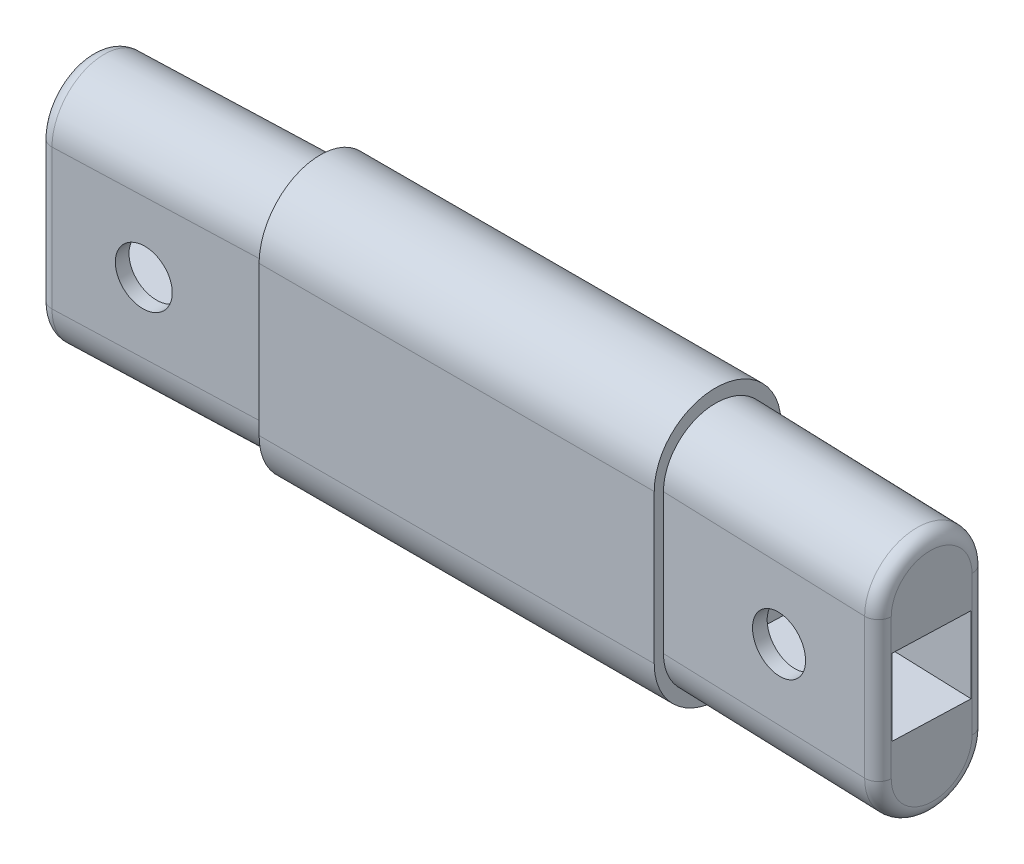
ISO-10303-21;
HEADER;
FILE_DESCRIPTION(('STEP AP214'),'2;1');
FILE_NAME('part.step','',(''),(''),'','','');
FILE_SCHEMA(('AUTOMOTIVE_DESIGN { 1 0 10303 214 1 1 1 1 }'));
ENDSEC;
DATA;
#1=APPLICATION_CONTEXT('core data for automotive mechanical design processes');
#2=APPLICATION_PROTOCOL_DEFINITION('international standard','automotive_design',2000,#1);
#3=PRODUCT_CONTEXT('',#1,'mechanical');
#4=PRODUCT('Part','Part','',(#3));
#5=PRODUCT_RELATED_PRODUCT_CATEGORY('part','',(#4));
#6=PRODUCT_DEFINITION_FORMATION('','',#4);
#7=PRODUCT_DEFINITION_CONTEXT('part definition',#1,'design');
#8=PRODUCT_DEFINITION('design','',#6,#7);
#9=PRODUCT_DEFINITION_SHAPE('','',#8);
#10=(LENGTH_UNIT() NAMED_UNIT(*) SI_UNIT(.MILLI.,.METRE.));
#11=(NAMED_UNIT(*) PLANE_ANGLE_UNIT() SI_UNIT($,.RADIAN.));
#12=(NAMED_UNIT(*) SI_UNIT($,.STERADIAN.) SOLID_ANGLE_UNIT());
#13=UNCERTAINTY_MEASURE_WITH_UNIT(LENGTH_MEASURE(1.E-05),#10,'distance_accuracy_value','');
#14=(GEOMETRIC_REPRESENTATION_CONTEXT(3) GLOBAL_UNCERTAINTY_ASSIGNED_CONTEXT((#13)) GLOBAL_UNIT_ASSIGNED_CONTEXT((#10,
#11,#12)) REPRESENTATION_CONTEXT('',''));
#15=CARTESIAN_POINT('',(0.,0.,0.));
#16=DIRECTION('',(0.,0.,1.));
#17=DIRECTION('',(1.,0.,0.));
#18=AXIS2_PLACEMENT_3D('',#15,#16,#17);
#19=CARTESIAN_POINT('',(-47.4847706754774,-7.9,0.872487417562356));
#20=DIRECTION('',(-0.999390827019096,0.,0.0348994967024943));
#21=DIRECTION('',(-0.0348994967024943,0.,-0.999390827019096));
#22=AXIS2_PLACEMENT_3D('',#19,#20,#21);
#23=PLANE('',#22);
#24=CARTESIAN_POINT('',(-47.4847706754774,7.9,0.872487417562356));
#25=DIRECTION('',(-0.999390827019096,0.,0.0348994967024943));
#26=DIRECTION('',(0.0348994967024943,0.,0.999390827019096));
#27=AXIS2_PLACEMENT_3D('',#24,#25,#26);
#28=CIRCLE('',#27,4.4);
#29=CARTESIAN_POINT('',(-47.3312128899864,7.9,5.26980705644638));
#30=VERTEX_POINT('',#29);
#31=CARTESIAN_POINT('',(-47.6383284609684,7.9,-3.52483222132166));
#32=VERTEX_POINT('',#31);
#33=EDGE_CURVE('E432',#30,#32,#28,.T.);
#34=ORIENTED_EDGE('',*,*,#33,.T.);
#35=DIRECTION('',(0.,1.,0.));
#36=VECTOR('',#35,1.);
#37=CARTESIAN_POINT('',(-47.6383284609684,-7.9,-3.52483222132167));
#38=LINE('',#37,#36);
#39=CARTESIAN_POINT('',(-47.6383284609684,-7.9,-3.52483222132166));
#40=VERTEX_POINT('',#39);
#41=EDGE_CURVE('E434',#32,#40,#38,.F.);
#42=ORIENTED_EDGE('',*,*,#41,.T.);
#43=CARTESIAN_POINT('',(-47.4847706754774,-7.9,0.872487417562356));
#44=DIRECTION('',(-0.999390827019096,0.,0.0348994967024943));
#45=DIRECTION('',(0.0348994967024943,0.,0.999390827019096));
#46=AXIS2_PLACEMENT_3D('',#43,#44,#45);
#47=CIRCLE('',#46,4.4);
#48=CARTESIAN_POINT('',(-47.3312128899864,-7.9,5.26980705644638));
#49=VERTEX_POINT('',#48);
#50=EDGE_CURVE('E428',#40,#49,#47,.T.);
#51=ORIENTED_EDGE('',*,*,#50,.T.);
#52=DIRECTION('',(0.,-1.,0.));
#53=VECTOR('',#52,1.);
#54=CARTESIAN_POINT('',(-47.3312128899864,-7.9,5.26980705644638));
#55=LINE('',#54,#53);
#56=EDGE_CURVE('E430',#49,#30,#55,.F.);
#57=ORIENTED_EDGE('',*,*,#56,.T.);
#58=EDGE_LOOP('',(#34,#42,#51,#57));
#59=FACE_BOUND('',#58,.T.);
#60=DIRECTION('',(0.0348994967024943,0.,0.999390827019096));
#61=VECTOR('',#60,1.);
#62=CARTESIAN_POINT('',(-47.6348385112981,4.3,-3.42489313861975));
#63=LINE('',#62,#61);
#64=CARTESIAN_POINT('',(-47.6348385112981,4.3,-3.42489313861975));
#65=VERTEX_POINT('',#64);
#66=CARTESIAN_POINT('',(-47.3347028396567,4.3,5.16986797374447));
#67=VERTEX_POINT('',#66);
#68=EDGE_CURVE('E252',#65,#67,#63,.T.);
#69=ORIENTED_EDGE('',*,*,#68,.T.);
#70=DIRECTION('',(0.,-1.,0.));
#71=VECTOR('',#70,1.);
#72=CARTESIAN_POINT('',(-47.3347028396567,4.3,5.16986797374447));
#73=LINE('',#72,#71);
#74=CARTESIAN_POINT('',(-47.3347028396567,-4.3,5.16986797374447));
#75=VERTEX_POINT('',#74);
#76=EDGE_CURVE('E58',#67,#75,#73,.T.);
#77=ORIENTED_EDGE('',*,*,#76,.T.);
#78=DIRECTION('',(-0.0348994967024943,0.,-0.999390827019096));
#79=VECTOR('',#78,1.);
#80=CARTESIAN_POINT('',(-47.6348385112981,-4.3,-3.42489313861976));
#81=LINE('',#80,#79);
#82=CARTESIAN_POINT('',(-47.6348385112981,-4.3,-3.42489313861976));
#83=VERTEX_POINT('',#82);
#84=EDGE_CURVE('E238',#75,#83,#81,.T.);
#85=ORIENTED_EDGE('',*,*,#84,.T.);
#86=DIRECTION('',(0.,1.,0.));
#87=VECTOR('',#86,1.);
#88=CARTESIAN_POINT('',(-47.6348385112981,4.3,-3.42489313861975));
#89=LINE('',#88,#87);
#90=EDGE_CURVE('E242',#83,#65,#89,.T.);
#91=ORIENTED_EDGE('',*,*,#90,.T.);
#92=EDGE_LOOP('',(#69,#77,#85,#91));
#93=FACE_BOUND('',#92,.T.);
#94=ADVANCED_FACE('F41',(#59,#93),#23,.T.);
#95=CARTESIAN_POINT('',(22.8492076949174,-15.3,-10.));
#96=DIRECTION('',(-0.999390827019096,0.,-0.0348994967024942));
#97=DIRECTION('',(-0.0348994967024942,0.,0.999390827019096));
#98=AXIS2_PLACEMENT_3D('',#95,#96,#97);
#99=PLANE('',#98);
#100=CARTESIAN_POINT('',(22.5,8.4,0.));
#101=DIRECTION('',(-0.999390827019096,0.,-0.0348994967024942));
#102=DIRECTION('',(0.0348994967024942,0.,-0.999390827019096));
#103=AXIS2_PLACEMENT_3D('',#100,#101,#102);
#104=ELLIPSE('',#103,6.90420585566187,6.90000000000001);
#105=CARTESIAN_POINT('',(22.259046690507,8.4,6.90000000000001));
#106=VERTEX_POINT('',#105);
#107=CARTESIAN_POINT('',(22.740953309493,8.4,-6.9));
#108=VERTEX_POINT('',#107);
#109=EDGE_CURVE('E358',#106,#108,#104,.T.);
#110=ORIENTED_EDGE('',*,*,#109,.F.);
#111=DIRECTION('',(0.,1.,0.));
#112=VECTOR('',#111,1.);
#113=CARTESIAN_POINT('',(22.259046690507,8.4,6.90000000000001));
#114=LINE('',#113,#112);
#115=CARTESIAN_POINT('',(22.259046690507,-8.4,6.90000000000001));
#116=VERTEX_POINT('',#115);
#117=EDGE_CURVE('E391',#116,#106,#114,.T.);
#118=ORIENTED_EDGE('',*,*,#117,.F.);
#119=CARTESIAN_POINT('',(22.5,-8.4,0.));
#120=DIRECTION('',(-0.999390827019096,0.,-0.0348994967024942));
#121=DIRECTION('',(0.0348994967024942,0.,-0.999390827019096));
#122=AXIS2_PLACEMENT_3D('',#119,#120,#121);
#123=ELLIPSE('',#122,6.90420585566187,6.90000000000001);
#124=CARTESIAN_POINT('',(22.740953309493,-8.4,-6.90000000000001));
#125=VERTEX_POINT('',#124);
#126=EDGE_CURVE('E359',#125,#116,#123,.T.);
#127=ORIENTED_EDGE('',*,*,#126,.F.);
#128=DIRECTION('',(0.,-1.,0.));
#129=VECTOR('',#128,1.);
#130=CARTESIAN_POINT('',(22.740953309493,8.4,-6.9));
#131=LINE('',#130,#129);
#132=EDGE_CURVE('E362',#108,#125,#131,.T.);
#133=ORIENTED_EDGE('',*,*,#132,.F.);
#134=EDGE_LOOP('',(#110,#118,#127,#133));
#135=FACE_BOUND('',#134,.T.);
#136=CARTESIAN_POINT('',(22.5,-7.9,0.));
#137=DIRECTION('',(0.999390827019096,0.,0.0348994967024943));
#138=DIRECTION('',(0.0348994967024943,0.,-0.999390827019096));
#139=AXIS2_PLACEMENT_3D('',#136,#137,#138);
#140=CIRCLE('',#139,5.9);
#141=CARTESIAN_POINT('',(22.2940929694553,-7.9,5.89640587941267));
#142=VERTEX_POINT('',#141);
#143=CARTESIAN_POINT('',(22.7059070305447,-7.9,-5.89640587941267));
#144=VERTEX_POINT('',#143);
#145=EDGE_CURVE('E332',#142,#144,#140,.T.);
#146=ORIENTED_EDGE('',*,*,#145,.F.);
#147=DIRECTION('',(0.,-1.,0.));
#148=VECTOR('',#147,1.);
#149=CARTESIAN_POINT('',(22.2940929694553,-7.9,5.89640587941267));
#150=LINE('',#149,#148);
#151=CARTESIAN_POINT('',(22.2940929694553,7.9,5.89640587941267));
#152=VERTEX_POINT('',#151);
#153=EDGE_CURVE('E344',#152,#142,#150,.T.);
#154=ORIENTED_EDGE('',*,*,#153,.F.);
#155=CARTESIAN_POINT('',(22.5,7.9,0.));
#156=DIRECTION('',(0.999390827019096,0.,0.0348994967024943));
#157=DIRECTION('',(0.0348994967024943,0.,-0.999390827019096));
#158=AXIS2_PLACEMENT_3D('',#155,#156,#157);
#159=CIRCLE('',#158,5.9);
#160=CARTESIAN_POINT('',(22.7059070305447,7.9,-5.89640587941267));
#161=VERTEX_POINT('',#160);
#162=EDGE_CURVE('E340',#161,#152,#159,.T.);
#163=ORIENTED_EDGE('',*,*,#162,.F.);
#164=DIRECTION('',(0.,1.,0.));
#165=VECTOR('',#164,1.);
#166=CARTESIAN_POINT('',(22.7059070305447,-7.9,-5.89640587941267));
#167=LINE('',#166,#165);
#168=EDGE_CURVE('E336',#144,#161,#167,.T.);
#169=ORIENTED_EDGE('',*,*,#168,.F.);
#170=EDGE_LOOP('',(#146,#154,#163,#169));
#171=FACE_BOUND('',#170,.T.);
#172=ADVANCED_FACE('F493',(#135,#171),#99,.F.);
#173=CARTESIAN_POINT('',(-23.,8.4,0.));
#174=DIRECTION('',(1.,0.,0.));
#175=DIRECTION('',(0.,0.,-1.));
#176=AXIS2_PLACEMENT_3D('',#173,#174,#175);
#177=CYLINDRICAL_SURFACE('',#176,6.90000000000001);
#178=CARTESIAN_POINT('',(-22.5,8.4,0.));
#179=DIRECTION('',(0.999390827019096,0.,-0.0348994967024942));
#180=DIRECTION('',(0.0348994967024942,0.,0.999390827019096));
#181=AXIS2_PLACEMENT_3D('',#178,#179,#180);
#182=ELLIPSE('',#181,6.90420585566187,6.90000000000001);
#183=CARTESIAN_POINT('',(-22.740953309493,8.4,-6.9));
#184=VERTEX_POINT('',#183);
#185=CARTESIAN_POINT('',(-22.259046690507,8.4,6.90000000000001));
#186=VERTEX_POINT('',#185);
#187=EDGE_CURVE('E374',#184,#186,#182,.T.);
#188=ORIENTED_EDGE('',*,*,#187,.T.);
#189=DIRECTION('',(1.,0.,0.));
#190=VECTOR('',#189,1.);
#191=CARTESIAN_POINT('',(-23.,8.4,6.90000000000001));
#192=LINE('',#191,#190);
#193=EDGE_CURVE('E377',#186,#106,#192,.T.);
#194=ORIENTED_EDGE('',*,*,#193,.T.);
#195=ORIENTED_EDGE('',*,*,#109,.T.);
#196=DIRECTION('',(1.,0.,0.));
#197=VECTOR('',#196,1.);
#198=CARTESIAN_POINT('',(-23.,8.4,-6.9));
#199=LINE('',#198,#197);
#200=EDGE_CURVE('E388',#184,#108,#199,.T.);
#201=ORIENTED_EDGE('',*,*,#200,.F.);
#202=EDGE_LOOP('',(#188,#194,#195,#201));
#203=FACE_BOUND('',#202,.T.);
#204=ADVANCED_FACE('F498',(#203),#177,.T.);
#205=CARTESIAN_POINT('',(-23.,8.4,-6.9));
#206=DIRECTION('',(0.,0.,1.));
#207=DIRECTION('',(1.,0.,0.));
#208=AXIS2_PLACEMENT_3D('',#205,#206,#207);
#209=PLANE('',#208);
#210=DIRECTION('',(1.,0.,0.));
#211=VECTOR('',#210,1.);
#212=CARTESIAN_POINT('',(-23.,-8.4,-6.90000000000001));
#213=LINE('',#212,#211);
#214=CARTESIAN_POINT('',(-22.740953309493,-8.4,-6.90000000000001));
#215=VERTEX_POINT('',#214);
#216=EDGE_CURVE('E385',#215,#125,#213,.T.);
#217=ORIENTED_EDGE('',*,*,#216,.F.);
#218=DIRECTION('',(0.,1.,0.));
#219=VECTOR('',#218,1.);
#220=CARTESIAN_POINT('',(-22.740953309493,8.4,-6.9));
#221=LINE('',#220,#219);
#222=EDGE_CURVE('E371',#215,#184,#221,.T.);
#223=ORIENTED_EDGE('',*,*,#222,.T.);
#224=ORIENTED_EDGE('',*,*,#200,.T.);
#225=ORIENTED_EDGE('',*,*,#132,.T.);
#226=EDGE_LOOP('',(#217,#223,#224,#225));
#227=FACE_BOUND('',#226,.T.);
#228=ADVANCED_FACE('F538',(#227),#209,.F.);
#229=CARTESIAN_POINT('',(-23.,-8.4,0.));
#230=DIRECTION('',(1.,0.,0.));
#231=DIRECTION('',(0.,0.,-1.));
#232=AXIS2_PLACEMENT_3D('',#229,#230,#231);
#233=CYLINDRICAL_SURFACE('',#232,6.90000000000001);
#234=CARTESIAN_POINT('',(-22.5,-8.4,0.));
#235=DIRECTION('',(0.999390827019096,0.,-0.0348994967024942));
#236=DIRECTION('',(0.0348994967024942,0.,0.999390827019096));
#237=AXIS2_PLACEMENT_3D('',#234,#235,#236);
#238=ELLIPSE('',#237,6.90420585566187,6.90000000000001);
#239=CARTESIAN_POINT('',(-22.259046690507,-8.4,6.90000000000001));
#240=VERTEX_POINT('',#239);
#241=EDGE_CURVE('E368',#240,#215,#238,.T.);
#242=ORIENTED_EDGE('',*,*,#241,.T.);
#243=ORIENTED_EDGE('',*,*,#216,.T.);
#244=ORIENTED_EDGE('',*,*,#126,.T.);
#245=DIRECTION('',(1.,0.,0.));
#246=VECTOR('',#245,1.);
#247=CARTESIAN_POINT('',(-23.,-8.4,6.90000000000001));
#248=LINE('',#247,#246);
#249=EDGE_CURVE('E381',#240,#116,#248,.T.);
#250=ORIENTED_EDGE('',*,*,#249,.F.);
#251=EDGE_LOOP('',(#242,#243,#244,#250));
#252=FACE_BOUND('',#251,.T.);
#253=ADVANCED_FACE('F542',(#252),#233,.T.);
#254=CARTESIAN_POINT('',(-23.,8.4,6.90000000000001));
#255=DIRECTION('',(0.,0.,-1.));
#256=DIRECTION('',(-1.,0.,0.));
#257=AXIS2_PLACEMENT_3D('',#254,#255,#256);
#258=PLANE('',#257);
#259=ORIENTED_EDGE('',*,*,#193,.F.);
#260=DIRECTION('',(0.,-1.,0.));
#261=VECTOR('',#260,1.);
#262=CARTESIAN_POINT('',(-22.259046690507,8.4,6.90000000000001));
#263=LINE('',#262,#261);
#264=EDGE_CURVE('E395',#186,#240,#263,.T.);
#265=ORIENTED_EDGE('',*,*,#264,.T.);
#266=ORIENTED_EDGE('',*,*,#249,.T.);
#267=ORIENTED_EDGE('',*,*,#117,.T.);
#268=EDGE_LOOP('',(#259,#265,#266,#267));
#269=FACE_BOUND('',#268,.T.);
#270=ADVANCED_FACE('F546',(#269),#258,.F.);
#271=CARTESIAN_POINT('',(-22.8492076949174,-15.3,-10.));
#272=DIRECTION('',(0.999390827019096,0.,-0.0348994967024942));
#273=DIRECTION('',(-0.0348994967024942,0.,-0.999390827019096));
#274=AXIS2_PLACEMENT_3D('',#271,#272,#273);
#275=PLANE('',#274);
#276=DIRECTION('',(0.,-1.,0.));
#277=VECTOR('',#276,1.);
#278=CARTESIAN_POINT('',(-22.2940929694553,-7.9,5.89640587941267));
#279=LINE('',#278,#277);
#280=CARTESIAN_POINT('',(-22.2940929694553,7.9,5.89640587941267));
#281=VERTEX_POINT('',#280);
#282=CARTESIAN_POINT('',(-22.2940929694553,-7.9,5.89640587941267));
#283=VERTEX_POINT('',#282);
#284=EDGE_CURVE('E267',#281,#283,#279,.T.);
#285=ORIENTED_EDGE('',*,*,#284,.T.);
#286=CARTESIAN_POINT('',(-22.5,-7.9,0.));
#287=DIRECTION('',(0.999390827019096,0.,-0.0348994967024943));
#288=DIRECTION('',(-0.0348994967024943,0.,-0.999390827019096));
#289=AXIS2_PLACEMENT_3D('',#286,#287,#288);
#290=CIRCLE('',#289,5.9);
#291=CARTESIAN_POINT('',(-22.7059070305447,-7.9,-5.89640587941267));
#292=VERTEX_POINT('',#291);
#293=EDGE_CURVE('E263',#283,#292,#290,.T.);
#294=ORIENTED_EDGE('',*,*,#293,.T.);
#295=DIRECTION('',(0.,1.,0.));
#296=VECTOR('',#295,1.);
#297=CARTESIAN_POINT('',(-22.7059070305447,-7.9,-5.89640587941267));
#298=LINE('',#297,#296);
#299=CARTESIAN_POINT('',(-22.7059070305447,7.9,-5.89640587941267));
#300=VERTEX_POINT('',#299);
#301=EDGE_CURVE('E275',#292,#300,#298,.T.);
#302=ORIENTED_EDGE('',*,*,#301,.T.);
#303=CARTESIAN_POINT('',(-22.5,7.9,0.));
#304=DIRECTION('',(0.999390827019096,0.,-0.0348994967024943));
#305=DIRECTION('',(-0.0348994967024943,0.,-0.999390827019096));
#306=AXIS2_PLACEMENT_3D('',#303,#304,#305);
#307=CIRCLE('',#306,5.9);
#308=EDGE_CURVE('E271',#300,#281,#307,.T.);
#309=ORIENTED_EDGE('',*,*,#308,.T.);
#310=EDGE_LOOP('',(#285,#294,#302,#309));
#311=FACE_BOUND('',#310,.T.);
#312=ORIENTED_EDGE('',*,*,#187,.F.);
#313=ORIENTED_EDGE('',*,*,#222,.F.);
#314=ORIENTED_EDGE('',*,*,#241,.F.);
#315=ORIENTED_EDGE('',*,*,#264,.F.);
#316=EDGE_LOOP('',(#312,#313,#314,#315));
#317=FACE_BOUND('',#316,.T.);
#318=ADVANCED_FACE('F475',(#311,#317),#275,.F.);
#319=CARTESIAN_POINT('',(47.4847706754774,-7.9,0.872487417562356));
#320=DIRECTION('',(-0.999390827019096,0.,-0.0348994967024943));
#321=DIRECTION('',(-0.0348994967024943,0.,0.999390827019096));
#322=AXIS2_PLACEMENT_3D('',#319,#320,#321);
#323=CYLINDRICAL_SURFACE('',#322,5.9);
#324=DIRECTION('',(-0.999390827019096,0.,-0.0348994967024943));
#325=VECTOR('',#324,1.);
#326=CARTESIAN_POINT('',(47.6906777060221,-7.9,-5.02391846185031));
#327=LINE('',#326,#325);
#328=CARTESIAN_POINT('',(46.1915914654935,-7.9,-5.07626770690405));
#329=VERTEX_POINT('',#328);
#330=EDGE_CURVE('E356',#329,#144,#327,.T.);
#331=ORIENTED_EDGE('',*,*,#330,.F.);
#332=CARTESIAN_POINT('',(45.9856844349488,-7.9,0.820138172508615));
#333=DIRECTION('',(0.999390827019096,0.,0.0348994967024943));
#334=DIRECTION('',(0.0348994967024943,0.,-0.999390827019096));
#335=AXIS2_PLACEMENT_3D('',#332,#333,#334);
#336=CIRCLE('',#335,5.9);
#337=CARTESIAN_POINT('',(45.779777404404,-7.9,6.71654405192128));
#338=VERTEX_POINT('',#337);
#339=EDGE_CURVE('E415',#329,#338,#336,.F.);
#340=ORIENTED_EDGE('',*,*,#339,.T.);
#341=DIRECTION('',(-0.999390827019096,0.,-0.0348994967024943));
#342=VECTOR('',#341,1.);
#343=CARTESIAN_POINT('',(47.2788636449327,-7.9,6.76889329697502));
#344=LINE('',#343,#342);
#345=EDGE_CURVE('E348',#338,#142,#344,.T.);
#346=ORIENTED_EDGE('',*,*,#345,.T.);
#347=ORIENTED_EDGE('',*,*,#145,.T.);
#348=EDGE_LOOP('',(#331,#340,#346,#347));
#349=FACE_BOUND('',#348,.T.);
#350=ADVANCED_FACE('F553',(#349),#323,.T.);
#351=CARTESIAN_POINT('',(47.6906777060221,-7.9,-5.02391846185031));
#352=DIRECTION('',(-0.0348994967024943,0.,0.999390827019096));
#353=DIRECTION('',(0.999390827019096,0.,0.0348994967024943));
#354=AXIS2_PLACEMENT_3D('',#351,#352,#353);
#355=PLANE('',#354);
#356=DIRECTION('',(-0.999390827019096,0.,-0.0348994967024943));
#357=VECTOR('',#356,1.);
#358=CARTESIAN_POINT('',(47.6906777060221,7.9,-5.02391846185031));
#359=LINE('',#358,#357);
#360=CARTESIAN_POINT('',(46.1915914654935,7.9,-5.07626770690405));
#361=VERTEX_POINT('',#360);
#362=EDGE_CURVE('E354',#361,#161,#359,.T.);
#363=ORIENTED_EDGE('',*,*,#362,.F.);
#364=DIRECTION('',(0.,1.,0.));
#365=VECTOR('',#364,1.);
#366=CARTESIAN_POINT('',(46.1915914654935,-7.9,-5.07626770690405));
#367=LINE('',#366,#365);
#368=EDGE_CURVE('E413',#361,#329,#367,.F.);
#369=ORIENTED_EDGE('',*,*,#368,.T.);
#370=ORIENTED_EDGE('',*,*,#330,.T.);
#371=ORIENTED_EDGE('',*,*,#168,.T.);
#372=EDGE_LOOP('',(#363,#369,#370,#371));
#373=FACE_BOUND('',#372,.T.);
#374=ADVANCED_FACE('F556',(#373),#355,.F.);
#375=CARTESIAN_POINT('',(47.4847706754774,7.9,0.872487417562356));
#376=DIRECTION('',(-0.999390827019096,0.,-0.0348994967024943));
#377=DIRECTION('',(-0.0348994967024943,0.,0.999390827019096));
#378=AXIS2_PLACEMENT_3D('',#375,#376,#377);
#379=CYLINDRICAL_SURFACE('',#378,5.9);
#380=DIRECTION('',(-0.999390827019096,0.,-0.0348994967024943));
#381=VECTOR('',#380,1.);
#382=CARTESIAN_POINT('',(47.2788636449327,7.9,6.76889329697502));
#383=LINE('',#382,#381);
#384=CARTESIAN_POINT('',(45.779777404404,7.9,6.71654405192128));
#385=VERTEX_POINT('',#384);
#386=EDGE_CURVE('E351',#385,#152,#383,.T.);
#387=ORIENTED_EDGE('',*,*,#386,.F.);
#388=CARTESIAN_POINT('',(45.9856844349488,7.9,0.820138172508615));
#389=DIRECTION('',(0.999390827019096,0.,0.0348994967024943));
#390=DIRECTION('',(0.0348994967024943,0.,-0.999390827019096));
#391=AXIS2_PLACEMENT_3D('',#388,#389,#390);
#392=CIRCLE('',#391,5.9);
#393=EDGE_CURVE('E411',#385,#361,#392,.F.);
#394=ORIENTED_EDGE('',*,*,#393,.T.);
#395=ORIENTED_EDGE('',*,*,#362,.T.);
#396=ORIENTED_EDGE('',*,*,#162,.T.);
#397=EDGE_LOOP('',(#387,#394,#395,#396));
#398=FACE_BOUND('',#397,.T.);
#399=ADVANCED_FACE('F560',(#398),#379,.T.);
#400=CARTESIAN_POINT('',(47.2788636449327,-7.9,6.76889329697502));
#401=DIRECTION('',(0.0348994967024943,0.,-0.999390827019096));
#402=DIRECTION('',(-0.999390827019096,0.,-0.0348994967024943));
#403=AXIS2_PLACEMENT_3D('',#400,#401,#402);
#404=PLANE('',#403);
#405=CARTESIAN_POINT('',(35.7858691342131,0.,6.36754908489634));
#406=DIRECTION('',(-0.0348994967024943,0.,0.999390827019096));
#407=DIRECTION('',(0.999390827019096,0.,0.0348994967024943));
#408=AXIS2_PLACEMENT_3D('',#405,#406,#407);
#409=CIRCLE('',#408,3.10000000000001);
#410=CARTESIAN_POINT('',(38.8839806979723,0.,6.47573752467407));
#411=VERTEX_POINT('',#410);
#412=EDGE_CURVE('E288',#411,#411,#409,.T.);
#413=ORIENTED_EDGE('',*,*,#412,.F.);
#414=EDGE_LOOP('',(#413));
#415=FACE_BOUND('',#414,.T.);
#416=ORIENTED_EDGE('',*,*,#345,.F.);
#417=DIRECTION('',(0.,-1.,0.));
#418=VECTOR('',#417,1.);
#419=CARTESIAN_POINT('',(45.779777404404,7.9,6.71654405192128));
#420=LINE('',#419,#418);
#421=EDGE_CURVE('E408',#338,#385,#420,.F.);
#422=ORIENTED_EDGE('',*,*,#421,.T.);
#423=ORIENTED_EDGE('',*,*,#386,.T.);
#424=ORIENTED_EDGE('',*,*,#153,.T.);
#425=EDGE_LOOP('',(#416,#422,#423,#424));
#426=FACE_BOUND('',#425,.T.);
#427=ADVANCED_FACE('F564',(#415,#426),#404,.F.);
#428=CARTESIAN_POINT('',(47.4847706754774,-7.9,0.872487417562356));
#429=DIRECTION('',(0.999390827019096,0.,0.0348994967024943));
#430=DIRECTION('',(0.0348994967024943,0.,-0.999390827019096));
#431=AXIS2_PLACEMENT_3D('',#428,#429,#430);
#432=PLANE('',#431);
#433=DIRECTION('',(0.,-1.,0.));
#434=VECTOR('',#433,1.);
#435=CARTESIAN_POINT('',(47.3347028396567,4.3,5.16986797374447));
#436=LINE('',#435,#434);
#437=CARTESIAN_POINT('',(47.3347028396567,4.3,5.16986797374447));
#438=VERTEX_POINT('',#437);
#439=CARTESIAN_POINT('',(47.3347028396567,-4.3,5.16986797374447));
#440=VERTEX_POINT('',#439);
#441=EDGE_CURVE('E294',#438,#440,#436,.T.);
#442=ORIENTED_EDGE('',*,*,#441,.F.);
#443=DIRECTION('',(-0.0348994967024943,0.,0.999390827019096));
#444=VECTOR('',#443,1.);
#445=CARTESIAN_POINT('',(47.6348385112981,4.3,-3.42489313861975));
#446=LINE('',#445,#444);
#447=CARTESIAN_POINT('',(47.6348385112981,4.3,-3.42489313861975));
#448=VERTEX_POINT('',#447);
#449=EDGE_CURVE('E300',#448,#438,#446,.T.);
#450=ORIENTED_EDGE('',*,*,#449,.F.);
#451=DIRECTION('',(0.,1.,0.));
#452=VECTOR('',#451,1.);
#453=CARTESIAN_POINT('',(47.6348385112981,4.3,-3.42489313861975));
#454=LINE('',#453,#452);
#455=CARTESIAN_POINT('',(47.6348385112981,-4.3,-3.42489313861976));
#456=VERTEX_POINT('',#455);
#457=EDGE_CURVE('E316',#456,#448,#454,.T.);
#458=ORIENTED_EDGE('',*,*,#457,.F.);
#459=DIRECTION('',(0.0348994967024943,0.,-0.999390827019096));
#460=VECTOR('',#459,1.);
#461=CARTESIAN_POINT('',(47.6348385112981,-4.3,-3.42489313861976));
#462=LINE('',#461,#460);
#463=EDGE_CURVE('E313',#440,#456,#462,.T.);
#464=ORIENTED_EDGE('',*,*,#463,.F.);
#465=EDGE_LOOP('',(#442,#450,#458,#464));
#466=FACE_BOUND('',#465,.T.);
#467=CARTESIAN_POINT('',(47.4847706754774,7.9,0.872487417562356));
#468=DIRECTION('',(0.999390827019096,0.,0.0348994967024943));
#469=DIRECTION('',(0.0348994967024943,0.,-0.999390827019096));
#470=AXIS2_PLACEMENT_3D('',#467,#468,#469);
#471=CIRCLE('',#470,4.4);
#472=CARTESIAN_POINT('',(47.6383284609684,7.9,-3.52483222132167));
#473=VERTEX_POINT('',#472);
#474=CARTESIAN_POINT('',(47.3312128899864,7.9,5.26980705644638));
#475=VERTEX_POINT('',#474);
#476=EDGE_CURVE('E403',#473,#475,#471,.T.);
#477=ORIENTED_EDGE('',*,*,#476,.T.);
#478=DIRECTION('',(0.,-1.,0.));
#479=VECTOR('',#478,1.);
#480=CARTESIAN_POINT('',(47.3312128899864,-7.9,5.26980705644638));
#481=LINE('',#480,#479);
#482=CARTESIAN_POINT('',(47.3312128899864,-7.9,5.26980705644638));
#483=VERTEX_POINT('',#482);
#484=EDGE_CURVE('E405',#475,#483,#481,.T.);
#485=ORIENTED_EDGE('',*,*,#484,.T.);
#486=CARTESIAN_POINT('',(47.4847706754774,-7.9,0.872487417562356));
#487=DIRECTION('',(0.999390827019096,0.,0.0348994967024943));
#488=DIRECTION('',(0.0348994967024943,0.,-0.999390827019096));
#489=AXIS2_PLACEMENT_3D('',#486,#487,#488);
#490=CIRCLE('',#489,4.4);
#491=CARTESIAN_POINT('',(47.6383284609684,-7.9,-3.52483222132167));
#492=VERTEX_POINT('',#491);
#493=EDGE_CURVE('E399',#483,#492,#490,.T.);
#494=ORIENTED_EDGE('',*,*,#493,.T.);
#495=DIRECTION('',(0.,1.,0.));
#496=VECTOR('',#495,1.);
#497=CARTESIAN_POINT('',(47.6383284609684,7.9,-3.52483222132167));
#498=LINE('',#497,#496);
#499=EDGE_CURVE('E401',#492,#473,#498,.T.);
#500=ORIENTED_EDGE('',*,*,#499,.T.);
#501=EDGE_LOOP('',(#477,#485,#494,#500));
#502=FACE_BOUND('',#501,.T.);
#503=ADVANCED_FACE('F522',(#466,#502),#432,.T.);
#504=CARTESIAN_POINT('',(46.1392422204397,-7.9,-3.57718146637541));
#505=DIRECTION('',(0.,-1.,0.));
#506=DIRECTION('',(0.,0.,-1.));
#507=AXIS2_PLACEMENT_3D('',#504,#505,#506);
#508=CYLINDRICAL_SURFACE('',#507,1.5);
#509=CARTESIAN_POINT('',(46.1392422204397,-7.9,-3.57718146637541));
#510=DIRECTION('',(0.,-1.,0.));
#511=DIRECTION('',(0.,0.,-1.));
#512=AXIS2_PLACEMENT_3D('',#509,#510,#511);
#513=CIRCLE('',#512,1.5);
#514=EDGE_CURVE('E421',#329,#492,#513,.T.);
#515=ORIENTED_EDGE('',*,*,#514,.F.);
#516=ORIENTED_EDGE('',*,*,#368,.F.);
#517=CARTESIAN_POINT('',(46.1392422204397,7.9,-3.57718146637541));
#518=DIRECTION('',(0.,1.,0.));
#519=DIRECTION('',(0.,0.,1.));
#520=AXIS2_PLACEMENT_3D('',#517,#518,#519);
#521=CIRCLE('',#520,1.5);
#522=EDGE_CURVE('E337',#473,#361,#521,.T.);
#523=ORIENTED_EDGE('',*,*,#522,.F.);
#524=ORIENTED_EDGE('',*,*,#499,.F.);
#525=EDGE_LOOP('',(#515,#516,#523,#524));
#526=FACE_BOUND('',#525,.T.);
#527=ADVANCED_FACE('F518',(#526),#508,.T.);
#528=CARTESIAN_POINT('',(45.9856844349488,7.9,0.820138172508615));
#529=DIRECTION('',(0.999390827019096,0.,0.0348994967024943));
#530=DIRECTION('',(0.0348994967024943,0.,-0.999390827019096));
#531=AXIS2_PLACEMENT_3D('',#528,#529,#530);
#532=TOROIDAL_SURFACE('',#531,4.4,1.5);
#533=ORIENTED_EDGE('',*,*,#522,.T.);
#534=ORIENTED_EDGE('',*,*,#393,.F.);
#535=CARTESIAN_POINT('',(45.8321266494578,7.9,5.21745781139264));
#536=DIRECTION('',(0.,-1.,0.));
#537=DIRECTION('',(0.,0.,-1.));
#538=AXIS2_PLACEMENT_3D('',#535,#536,#537);
#539=CIRCLE('',#538,1.5);
#540=EDGE_CURVE('E419',#475,#385,#539,.T.);
#541=ORIENTED_EDGE('',*,*,#540,.F.);
#542=ORIENTED_EDGE('',*,*,#476,.F.);
#543=EDGE_LOOP('',(#533,#534,#541,#542));
#544=FACE_BOUND('',#543,.T.);
#545=ADVANCED_FACE('F521',(#544),#532,.T.);
#546=CARTESIAN_POINT('',(45.9856844349488,-7.9,0.820138172508615));
#547=DIRECTION('',(0.999390827019096,0.,0.0348994967024943));
#548=DIRECTION('',(0.0348994967024943,0.,-0.999390827019096));
#549=AXIS2_PLACEMENT_3D('',#546,#547,#548);
#550=TOROIDAL_SURFACE('',#549,4.4,1.5);
#551=ORIENTED_EDGE('',*,*,#514,.T.);
#552=ORIENTED_EDGE('',*,*,#493,.F.);
#553=CARTESIAN_POINT('',(45.8321266494578,-7.9,5.21745781139264));
#554=DIRECTION('',(0.,1.,0.));
#555=DIRECTION('',(0.,0.,1.));
#556=AXIS2_PLACEMENT_3D('',#553,#554,#555);
#557=CIRCLE('',#556,1.5);
#558=EDGE_CURVE('E324',#338,#483,#557,.T.);
#559=ORIENTED_EDGE('',*,*,#558,.F.);
#560=ORIENTED_EDGE('',*,*,#339,.F.);
#561=EDGE_LOOP('',(#551,#552,#559,#560));
#562=FACE_BOUND('',#561,.T.);
#563=ADVANCED_FACE('F526',(#562),#550,.T.);
#564=CARTESIAN_POINT('',(45.8321266494578,-7.9,5.21745781139264));
#565=DIRECTION('',(0.,1.,0.));
#566=DIRECTION('',(0.,0.,1.));
#567=AXIS2_PLACEMENT_3D('',#564,#565,#566);
#568=CYLINDRICAL_SURFACE('',#567,1.5);
#569=ORIENTED_EDGE('',*,*,#540,.T.);
#570=ORIENTED_EDGE('',*,*,#421,.F.);
#571=ORIENTED_EDGE('',*,*,#558,.T.);
#572=ORIENTED_EDGE('',*,*,#484,.F.);
#573=EDGE_LOOP('',(#569,#570,#571,#572));
#574=FACE_BOUND('',#573,.T.);
#575=ADVANCED_FACE('F530',(#574),#568,.T.);
#576=CARTESIAN_POINT('',(28.7460334571015,4.3,4.52073733507808));
#577=DIRECTION('',(-0.0348994967024943,0.,0.999390827019096));
#578=DIRECTION('',(0.999390827019096,0.,0.0348994967024943));
#579=AXIS2_PLACEMENT_3D('',#576,#577,#578);
#580=PLANE('',#579);
#581=CARTESIAN_POINT('',(35.841708328937,0.,4.76852376166578));
#582=DIRECTION('',(-0.0348994967024943,0.,0.999390827019096));
#583=DIRECTION('',(0.999390827019096,0.,0.0348994967024943));
#584=AXIS2_PLACEMENT_3D('',#581,#582,#583);
#585=CIRCLE('',#584,3.10000000000001);
#586=CARTESIAN_POINT('',(38.9398198926962,0.,4.87671220144352));
#587=VERTEX_POINT('',#586);
#588=EDGE_CURVE('E291',#587,#587,#585,.F.);
#589=ORIENTED_EDGE('',*,*,#588,.F.);
#590=EDGE_LOOP('',(#589));
#591=FACE_BOUND('',#590,.T.);
#592=ORIENTED_EDGE('',*,*,#441,.T.);
#593=DIRECTION('',(0.999390827019096,0.,0.0348994967024943));
#594=VECTOR('',#593,1.);
#595=CARTESIAN_POINT('',(28.7460334571015,-4.3,4.52073733507808));
#596=LINE('',#595,#594);
#597=CARTESIAN_POINT('',(28.7460334571015,-4.3,4.52073733507808));
#598=VERTEX_POINT('',#597);
#599=EDGE_CURVE('E311',#598,#440,#596,.T.);
#600=ORIENTED_EDGE('',*,*,#599,.F.);
#601=DIRECTION('',(0.,-1.,0.));
#602=VECTOR('',#601,1.);
#603=CARTESIAN_POINT('',(28.7460334571015,4.3,4.52073733507808));
#604=LINE('',#603,#602);
#605=CARTESIAN_POINT('',(28.7460334571015,4.3,4.52073733507808));
#606=VERTEX_POINT('',#605);
#607=EDGE_CURVE('E295',#606,#598,#604,.T.);
#608=ORIENTED_EDGE('',*,*,#607,.F.);
#609=DIRECTION('',(0.999390827019096,0.,0.0348994967024943));
#610=VECTOR('',#609,1.);
#611=CARTESIAN_POINT('',(28.7460334571015,4.3,4.52073733507808));
#612=LINE('',#611,#610);
#613=EDGE_CURVE('E321',#606,#438,#612,.T.);
#614=ORIENTED_EDGE('',*,*,#613,.T.);
#615=EDGE_LOOP('',(#592,#600,#608,#614));
#616=FACE_BOUND('',#615,.T.);
#617=ADVANCED_FACE('F534',(#591,#616),#580,.F.);
#618=CARTESIAN_POINT('',(29.0461691287429,4.3,-4.07402377728615));
#619=DIRECTION('',(0.,1.,0.));
#620=DIRECTION('',(0.,0.,1.));
#621=AXIS2_PLACEMENT_3D('',#618,#619,#620);
#622=PLANE('',#621);
#623=ORIENTED_EDGE('',*,*,#449,.T.);
#624=ORIENTED_EDGE('',*,*,#613,.F.);
#625=DIRECTION('',(-0.0348994967024943,0.,0.999390827019096));
#626=VECTOR('',#625,1.);
#627=CARTESIAN_POINT('',(29.0461691287429,4.3,-4.07402377728615));
#628=LINE('',#627,#626);
#629=CARTESIAN_POINT('',(29.0461691287429,4.3,-4.07402377728615));
#630=VERTEX_POINT('',#629);
#631=EDGE_CURVE('E307',#630,#606,#628,.T.);
#632=ORIENTED_EDGE('',*,*,#631,.F.);
#633=DIRECTION('',(0.999390827019096,0.,0.0348994967024943));
#634=VECTOR('',#633,1.);
#635=CARTESIAN_POINT('',(29.0461691287429,4.3,-4.07402377728615));
#636=LINE('',#635,#634);
#637=EDGE_CURVE('E325',#630,#448,#636,.T.);
#638=ORIENTED_EDGE('',*,*,#637,.T.);
#639=EDGE_LOOP('',(#623,#624,#632,#638));
#640=FACE_BOUND('',#639,.T.);
#641=ADVANCED_FACE('F574',(#640),#622,.F.);
#642=CARTESIAN_POINT('',(29.0461691287429,4.3,-4.07402377728615));
#643=DIRECTION('',(0.0348994967024943,0.,-0.999390827019096));
#644=DIRECTION('',(-0.999390827019096,0.,-0.0348994967024943));
#645=AXIS2_PLACEMENT_3D('',#642,#643,#644);
#646=PLANE('',#645);
#647=ORIENTED_EDGE('',*,*,#457,.T.);
#648=ORIENTED_EDGE('',*,*,#637,.F.);
#649=DIRECTION('',(0.,1.,0.));
#650=VECTOR('',#649,1.);
#651=CARTESIAN_POINT('',(29.0461691287429,4.3,-4.07402377728615));
#652=LINE('',#651,#650);
#653=CARTESIAN_POINT('',(29.0461691287429,-4.3,-4.07402377728615));
#654=VERTEX_POINT('',#653);
#655=EDGE_CURVE('E304',#654,#630,#652,.T.);
#656=ORIENTED_EDGE('',*,*,#655,.F.);
#657=DIRECTION('',(0.999390827019096,0.,0.0348994967024943));
#658=VECTOR('',#657,1.);
#659=CARTESIAN_POINT('',(29.0461691287429,-4.3,-4.07402377728615));
#660=LINE('',#659,#658);
#661=EDGE_CURVE('E327',#654,#456,#660,.T.);
#662=ORIENTED_EDGE('',*,*,#661,.T.);
#663=EDGE_LOOP('',(#647,#648,#656,#662));
#664=FACE_BOUND('',#663,.T.);
#665=ADVANCED_FACE('F580',(#664),#646,.F.);
#666=CARTESIAN_POINT('',(29.0461691287429,-4.3,-4.07402377728615));
#667=DIRECTION('',(0.,-1.,0.));
#668=DIRECTION('',(0.,0.,-1.));
#669=AXIS2_PLACEMENT_3D('',#666,#667,#668);
#670=PLANE('',#669);
#671=ORIENTED_EDGE('',*,*,#463,.T.);
#672=ORIENTED_EDGE('',*,*,#661,.F.);
#673=DIRECTION('',(0.0348994967024943,0.,-0.999390827019096));
#674=VECTOR('',#673,1.);
#675=CARTESIAN_POINT('',(29.0461691287429,-4.3,-4.07402377728615));
#676=LINE('',#675,#674);
#677=EDGE_CURVE('E299',#598,#654,#676,.T.);
#678=ORIENTED_EDGE('',*,*,#677,.F.);
#679=ORIENTED_EDGE('',*,*,#599,.T.);
#680=EDGE_LOOP('',(#671,#672,#678,#679));
#681=FACE_BOUND('',#680,.T.);
#682=ADVANCED_FACE('F576',(#681),#670,.F.);
#683=CARTESIAN_POINT('',(28.8686968583453,0.,1.00811710851722));
#684=DIRECTION('',(-0.999390827019096,0.,-0.0348994967024943));
#685=DIRECTION('',(-0.0348994967024943,0.,0.999390827019096));
#686=AXIS2_PLACEMENT_3D('',#683,#684,#685);
#687=PLANE('',#686);
#688=ORIENTED_EDGE('',*,*,#607,.T.);
#689=ORIENTED_EDGE('',*,*,#677,.T.);
#690=ORIENTED_EDGE('',*,*,#655,.T.);
#691=ORIENTED_EDGE('',*,*,#631,.T.);
#692=EDGE_LOOP('',(#688,#689,#690,#691));
#693=FACE_BOUND('',#692,.T.);
#694=ADVANCED_FACE('F579',(#693),#687,.F.);
#695=CARTESIAN_POINT('',(36.2630910606642,0.,-7.29829887312322));
#696=DIRECTION('',(-0.0348994967024943,0.,0.999390827019096));
#697=DIRECTION('',(0.999390827019096,0.,0.0348994967024943));
#698=AXIS2_PLACEMENT_3D('',#695,#696,#697);
#699=CYLINDRICAL_SURFACE('',#698,3.10000000000001);
#700=ORIENTED_EDGE('',*,*,#412,.T.);
#701=EDGE_LOOP('',(#700));
#702=FACE_BOUND('',#701,.T.);
#703=ORIENTED_EDGE('',*,*,#588,.T.);
#704=EDGE_LOOP('',(#703));
#705=FACE_BOUND('',#704,.T.);
#706=ADVANCED_FACE('F489',(#702,#705),#699,.F.);
#707=CARTESIAN_POINT('',(-47.4847706754774,-7.9,0.872487417562356));
#708=DIRECTION('',(0.999390827019096,0.,-0.0348994967024943));
#709=DIRECTION('',(-0.0348994967024943,0.,-0.999390827019096));
#710=AXIS2_PLACEMENT_3D('',#707,#708,#709);
#711=CYLINDRICAL_SURFACE('',#710,5.9);
#712=DIRECTION('',(0.999390827019096,0.,-0.0348994967024943));
#713=VECTOR('',#712,1.);
#714=CARTESIAN_POINT('',(-47.2788636449327,-7.9,6.76889329697502));
#715=LINE('',#714,#713);
#716=CARTESIAN_POINT('',(-45.779777404404,-7.9,6.71654405192128));
#717=VERTEX_POINT('',#716);
#718=EDGE_CURVE('E285',#717,#283,#715,.T.);
#719=ORIENTED_EDGE('',*,*,#718,.F.);
#720=CARTESIAN_POINT('',(-45.9856844349488,-7.9,0.820138172508615));
#721=DIRECTION('',(-0.999390827019096,0.,0.0348994967024943));
#722=DIRECTION('',(0.0348994967024943,0.,0.999390827019096));
#723=AXIS2_PLACEMENT_3D('',#720,#721,#722);
#724=CIRCLE('',#723,5.9);
#725=CARTESIAN_POINT('',(-46.1915914654935,-7.9,-5.07626770690405));
#726=VERTEX_POINT('',#725);
#727=EDGE_CURVE('E11',#717,#726,#724,.F.);
#728=ORIENTED_EDGE('',*,*,#727,.T.);
#729=DIRECTION('',(0.999390827019096,0.,-0.0348994967024943));
#730=VECTOR('',#729,1.);
#731=CARTESIAN_POINT('',(-47.6906777060221,-7.9,-5.02391846185031));
#732=LINE('',#731,#730);
#733=EDGE_CURVE('E278',#726,#292,#732,.T.);
#734=ORIENTED_EDGE('',*,*,#733,.T.);
#735=ORIENTED_EDGE('',*,*,#293,.F.);
#736=EDGE_LOOP('',(#719,#728,#734,#735));
#737=FACE_BOUND('',#736,.T.);
#738=ADVANCED_FACE('F479',(#737),#711,.T.);
#739=CARTESIAN_POINT('',(-47.2788636449327,-7.9,6.76889329697502));
#740=DIRECTION('',(0.0348994967024943,0.,0.999390827019096));
#741=DIRECTION('',(0.999390827019096,0.,-0.0348994967024943));
#742=AXIS2_PLACEMENT_3D('',#739,#740,#741);
#743=PLANE('',#742);
#744=CARTESIAN_POINT('',(-35.7858691342131,0.,6.36754908489634));
#745=DIRECTION('',(-0.0348994967024943,0.,-0.999390827019096));
#746=DIRECTION('',(-0.999390827019096,0.,0.0348994967024943));
#747=AXIS2_PLACEMENT_3D('',#744,#745,#746);
#748=CIRCLE('',#747,3.10000000000001);
#749=CARTESIAN_POINT('',(-38.8839806979723,0.,6.47573752467407));
#750=VERTEX_POINT('',#749);
#751=EDGE_CURVE('E736',#750,#750,#748,.T.);
#752=ORIENTED_EDGE('',*,*,#751,.T.);
#753=EDGE_LOOP('',(#752));
#754=FACE_BOUND('',#753,.T.);
#755=DIRECTION('',(0.999390827019096,0.,-0.0348994967024943));
#756=VECTOR('',#755,1.);
#757=CARTESIAN_POINT('',(-47.2788636449327,7.9,6.76889329697502));
#758=LINE('',#757,#756);
#759=CARTESIAN_POINT('',(-45.779777404404,7.9,6.71654405192128));
#760=VERTEX_POINT('',#759);
#761=EDGE_CURVE('E282',#760,#281,#758,.T.);
#762=ORIENTED_EDGE('',*,*,#761,.F.);
#763=DIRECTION('',(0.,-1.,0.));
#764=VECTOR('',#763,1.);
#765=CARTESIAN_POINT('',(-45.779777404404,-7.9,6.71654405192128));
#766=LINE('',#765,#764);
#767=EDGE_CURVE('E50',#760,#717,#766,.T.);
#768=ORIENTED_EDGE('',*,*,#767,.T.);
#769=ORIENTED_EDGE('',*,*,#718,.T.);
#770=ORIENTED_EDGE('',*,*,#284,.F.);
#771=EDGE_LOOP('',(#762,#768,#769,#770));
#772=FACE_BOUND('',#771,.T.);
#773=ADVANCED_FACE('F480',(#754,#772),#743,.T.);
#774=CARTESIAN_POINT('',(-47.4847706754774,7.9,0.872487417562356));
#775=DIRECTION('',(0.999390827019096,0.,-0.0348994967024943));
#776=DIRECTION('',(-0.0348994967024943,0.,-0.999390827019096));
#777=AXIS2_PLACEMENT_3D('',#774,#775,#776);
#778=CYLINDRICAL_SURFACE('',#777,5.9);
#779=DIRECTION('',(0.999390827019096,0.,-0.0348994967024943));
#780=VECTOR('',#779,1.);
#781=CARTESIAN_POINT('',(-47.6906777060221,7.9,-5.02391846185031));
#782=LINE('',#781,#780);
#783=CARTESIAN_POINT('',(-46.1915914654935,7.9,-5.07626770690405));
#784=VERTEX_POINT('',#783);
#785=EDGE_CURVE('E280',#784,#300,#782,.T.);
#786=ORIENTED_EDGE('',*,*,#785,.F.);
#787=CARTESIAN_POINT('',(-45.9856844349488,7.9,0.820138172508615));
#788=DIRECTION('',(-0.999390827019096,0.,0.0348994967024943));
#789=DIRECTION('',(0.0348994967024943,0.,0.999390827019096));
#790=AXIS2_PLACEMENT_3D('',#787,#788,#789);
#791=CIRCLE('',#790,5.9);
#792=EDGE_CURVE('E437',#784,#760,#791,.F.);
#793=ORIENTED_EDGE('',*,*,#792,.T.);
#794=ORIENTED_EDGE('',*,*,#761,.T.);
#795=ORIENTED_EDGE('',*,*,#308,.F.);
#796=EDGE_LOOP('',(#786,#793,#794,#795));
#797=FACE_BOUND('',#796,.T.);
#798=ADVANCED_FACE('F472',(#797),#778,.T.);
#799=CARTESIAN_POINT('',(-47.6906777060221,-7.9,-5.02391846185031));
#800=DIRECTION('',(-0.0348994967024943,0.,-0.999390827019096));
#801=DIRECTION('',(-0.999390827019096,0.,0.0348994967024943));
#802=AXIS2_PLACEMENT_3D('',#799,#800,#801);
#803=PLANE('',#802);
#804=ORIENTED_EDGE('',*,*,#733,.F.);
#805=DIRECTION('',(0.,1.,0.));
#806=VECTOR('',#805,1.);
#807=CARTESIAN_POINT('',(-46.1915914654935,-7.9,-5.07626770690405));
#808=LINE('',#807,#806);
#809=EDGE_CURVE('E417',#726,#784,#808,.T.);
#810=ORIENTED_EDGE('',*,*,#809,.T.);
#811=ORIENTED_EDGE('',*,*,#785,.T.);
#812=ORIENTED_EDGE('',*,*,#301,.F.);
#813=EDGE_LOOP('',(#804,#810,#811,#812));
#814=FACE_BOUND('',#813,.T.);
#815=ADVANCED_FACE('F469',(#814),#803,.T.);
#816=CARTESIAN_POINT('',(-45.8321266494578,-7.9,5.21745781139264));
#817=DIRECTION('',(0.,-1.,0.));
#818=DIRECTION('',(0.,0.,-1.));
#819=AXIS2_PLACEMENT_3D('',#816,#817,#818);
#820=CYLINDRICAL_SURFACE('',#819,1.5);
#821=CARTESIAN_POINT('',(-45.8321266494578,7.9,5.21745781139264));
#822=DIRECTION('',(0.,1.,0.));
#823=DIRECTION('',(0.,0.,1.));
#824=AXIS2_PLACEMENT_3D('',#821,#822,#823);
#825=CIRCLE('',#824,1.5);
#826=EDGE_CURVE('E442',#30,#760,#825,.T.);
#827=ORIENTED_EDGE('',*,*,#826,.F.);
#828=ORIENTED_EDGE('',*,*,#56,.F.);
#829=CARTESIAN_POINT('',(-45.8321266494578,-7.9,5.21745781139264));
#830=DIRECTION('',(0.,-1.,0.));
#831=DIRECTION('',(0.,0.,-1.));
#832=AXIS2_PLACEMENT_3D('',#829,#830,#831);
#833=CIRCLE('',#832,1.5);
#834=EDGE_CURVE('E45',#717,#49,#833,.T.);
#835=ORIENTED_EDGE('',*,*,#834,.F.);
#836=ORIENTED_EDGE('',*,*,#767,.F.);
#837=EDGE_LOOP('',(#827,#828,#835,#836));
#838=FACE_BOUND('',#837,.T.);
#839=ADVANCED_FACE('F43',(#838),#820,.T.);
#840=CARTESIAN_POINT('',(-45.9856844349488,-7.9,0.820138172508615));
#841=DIRECTION('',(-0.999390827019096,0.,0.0348994967024943));
#842=DIRECTION('',(0.0348994967024943,0.,0.999390827019096));
#843=AXIS2_PLACEMENT_3D('',#840,#841,#842);
#844=TOROIDAL_SURFACE('',#843,4.4,1.5);
#845=ORIENTED_EDGE('',*,*,#834,.T.);
#846=ORIENTED_EDGE('',*,*,#50,.F.);
#847=CARTESIAN_POINT('',(-46.1392422204397,-7.9,-3.57718146637541));
#848=DIRECTION('',(0.,1.,0.));
#849=DIRECTION('',(0.,0.,1.));
#850=AXIS2_PLACEMENT_3D('',#847,#848,#849);
#851=CIRCLE('',#850,1.5);
#852=EDGE_CURVE('E441',#726,#40,#851,.T.);
#853=ORIENTED_EDGE('',*,*,#852,.F.);
#854=ORIENTED_EDGE('',*,*,#727,.F.);
#855=EDGE_LOOP('',(#845,#846,#853,#854));
#856=FACE_BOUND('',#855,.T.);
#857=ADVANCED_FACE('F453',(#856),#844,.T.);
#858=CARTESIAN_POINT('',(-45.9856844349488,7.9,0.820138172508615));
#859=DIRECTION('',(-0.999390827019096,0.,0.0348994967024943));
#860=DIRECTION('',(0.0348994967024943,0.,0.999390827019096));
#861=AXIS2_PLACEMENT_3D('',#858,#859,#860);
#862=TOROIDAL_SURFACE('',#861,4.4,1.5);
#863=ORIENTED_EDGE('',*,*,#826,.T.);
#864=ORIENTED_EDGE('',*,*,#792,.F.);
#865=CARTESIAN_POINT('',(-46.1392422204397,7.9,-3.57718146637541));
#866=DIRECTION('',(0.,-1.,0.));
#867=DIRECTION('',(0.,0.,-1.));
#868=AXIS2_PLACEMENT_3D('',#865,#866,#867);
#869=CIRCLE('',#868,1.5);
#870=EDGE_CURVE('E259',#32,#784,#869,.T.);
#871=ORIENTED_EDGE('',*,*,#870,.F.);
#872=ORIENTED_EDGE('',*,*,#33,.F.);
#873=EDGE_LOOP('',(#863,#864,#871,#872));
#874=FACE_BOUND('',#873,.T.);
#875=ADVANCED_FACE('F464',(#874),#862,.T.);
#876=CARTESIAN_POINT('',(-46.1392422204397,-7.9,-3.57718146637541));
#877=DIRECTION('',(0.,1.,0.));
#878=DIRECTION('',(0.,0.,1.));
#879=AXIS2_PLACEMENT_3D('',#876,#877,#878);
#880=CYLINDRICAL_SURFACE('',#879,1.5);
#881=ORIENTED_EDGE('',*,*,#852,.T.);
#882=ORIENTED_EDGE('',*,*,#41,.F.);
#883=ORIENTED_EDGE('',*,*,#870,.T.);
#884=ORIENTED_EDGE('',*,*,#809,.F.);
#885=EDGE_LOOP('',(#881,#882,#883,#884));
#886=FACE_BOUND('',#885,.T.);
#887=ADVANCED_FACE('F462',(#886),#880,.T.);
#888=CARTESIAN_POINT('',(-28.7460334571015,4.3,4.52073733507808));
#889=DIRECTION('',(-0.0348994967024943,0.,-0.999390827019096));
#890=DIRECTION('',(-0.999390827019096,0.,0.0348994967024943));
#891=AXIS2_PLACEMENT_3D('',#888,#889,#890);
#892=PLANE('',#891);
#893=CARTESIAN_POINT('',(-35.841708328937,0.,4.76852376166578));
#894=DIRECTION('',(-0.0348994967024943,0.,-0.999390827019096));
#895=DIRECTION('',(-0.999390827019096,0.,0.0348994967024943));
#896=AXIS2_PLACEMENT_3D('',#893,#894,#895);
#897=CIRCLE('',#896,3.10000000000001);
#898=CARTESIAN_POINT('',(-38.9398198926962,0.,4.87671220144352));
#899=VERTEX_POINT('',#898);
#900=EDGE_CURVE('E245',#899,#899,#897,.T.);
#901=ORIENTED_EDGE('',*,*,#900,.F.);
#902=EDGE_LOOP('',(#901));
#903=FACE_BOUND('',#902,.T.);
#904=ORIENTED_EDGE('',*,*,#76,.F.);
#905=DIRECTION('',(-0.999390827019096,0.,0.0348994967024943));
#906=VECTOR('',#905,1.);
#907=CARTESIAN_POINT('',(-28.7460334571015,4.3,4.52073733507808));
#908=LINE('',#907,#906);
#909=CARTESIAN_POINT('',(-28.7460334571015,4.3,4.52073733507808));
#910=VERTEX_POINT('',#909);
#911=EDGE_CURVE('E220',#910,#67,#908,.T.);
#912=ORIENTED_EDGE('',*,*,#911,.F.);
#913=DIRECTION('',(0.,-1.,0.));
#914=VECTOR('',#913,1.);
#915=CARTESIAN_POINT('',(-28.7460334571015,4.3,4.52073733507808));
#916=LINE('',#915,#914);
#917=CARTESIAN_POINT('',(-28.7460334571015,-4.3,4.52073733507808));
#918=VERTEX_POINT('',#917);
#919=EDGE_CURVE('E228',#910,#918,#916,.T.);
#920=ORIENTED_EDGE('',*,*,#919,.T.);
#921=DIRECTION('',(-0.999390827019096,0.,0.0348994967024943));
#922=VECTOR('',#921,1.);
#923=CARTESIAN_POINT('',(-28.7460334571015,-4.3,4.52073733507808));
#924=LINE('',#923,#922);
#925=EDGE_CURVE('E256',#918,#75,#924,.T.);
#926=ORIENTED_EDGE('',*,*,#925,.T.);
#927=EDGE_LOOP('',(#904,#912,#920,#926));
#928=FACE_BOUND('',#927,.T.);
#929=ADVANCED_FACE('F231',(#903,#928),#892,.T.);
#930=CARTESIAN_POINT('',(-29.0461691287429,-4.3,-4.07402377728615));
#931=DIRECTION('',(0.,1.,0.));
#932=DIRECTION('',(0.,0.,1.));
#933=AXIS2_PLACEMENT_3D('',#930,#931,#932);
#934=PLANE('',#933);
#935=ORIENTED_EDGE('',*,*,#84,.F.);
#936=ORIENTED_EDGE('',*,*,#925,.F.);
#937=DIRECTION('',(-0.0348994967024943,0.,-0.999390827019096));
#938=VECTOR('',#937,1.);
#939=CARTESIAN_POINT('',(-29.0461691287429,-4.3,-4.07402377728615));
#940=LINE('',#939,#938);
#941=CARTESIAN_POINT('',(-29.0461691287429,-4.3,-4.07402377728615));
#942=VERTEX_POINT('',#941);
#943=EDGE_CURVE('E234',#918,#942,#940,.T.);
#944=ORIENTED_EDGE('',*,*,#943,.T.);
#945=DIRECTION('',(-0.999390827019096,0.,0.0348994967024943));
#946=VECTOR('',#945,1.);
#947=CARTESIAN_POINT('',(-29.0461691287429,-4.3,-4.07402377728615));
#948=LINE('',#947,#946);
#949=EDGE_CURVE('E260',#942,#83,#948,.T.);
#950=ORIENTED_EDGE('',*,*,#949,.T.);
#951=EDGE_LOOP('',(#935,#936,#944,#950));
#952=FACE_BOUND('',#951,.T.);
#953=ADVANCED_FACE('F684',(#952),#934,.T.);
#954=CARTESIAN_POINT('',(-29.0461691287429,4.3,-4.07402377728615));
#955=DIRECTION('',(0.0348994967024943,0.,0.999390827019096));
#956=DIRECTION('',(0.999390827019096,0.,-0.0348994967024943));
#957=AXIS2_PLACEMENT_3D('',#954,#955,#956);
#958=PLANE('',#957);
#959=ORIENTED_EDGE('',*,*,#90,.F.);
#960=ORIENTED_EDGE('',*,*,#949,.F.);
#961=DIRECTION('',(0.,1.,0.));
#962=VECTOR('',#961,1.);
#963=CARTESIAN_POINT('',(-29.0461691287429,4.3,-4.07402377728615));
#964=LINE('',#963,#962);
#965=CARTESIAN_POINT('',(-29.0461691287429,4.3,-4.07402377728615));
#966=VERTEX_POINT('',#965);
#967=EDGE_CURVE('E227',#942,#966,#964,.T.);
#968=ORIENTED_EDGE('',*,*,#967,.T.);
#969=DIRECTION('',(-0.999390827019096,0.,0.0348994967024943));
#970=VECTOR('',#969,1.);
#971=CARTESIAN_POINT('',(-29.0461691287429,4.3,-4.07402377728615));
#972=LINE('',#971,#970);
#973=EDGE_CURVE('E222',#966,#65,#972,.T.);
#974=ORIENTED_EDGE('',*,*,#973,.T.);
#975=EDGE_LOOP('',(#959,#960,#968,#974));
#976=FACE_BOUND('',#975,.T.);
#977=ADVANCED_FACE('F693',(#976),#958,.T.);
#978=CARTESIAN_POINT('',(-29.0461691287429,4.3,-4.07402377728615));
#979=DIRECTION('',(0.,-1.,0.));
#980=DIRECTION('',(0.,0.,-1.));
#981=AXIS2_PLACEMENT_3D('',#978,#979,#980);
#982=PLANE('',#981);
#983=ORIENTED_EDGE('',*,*,#68,.F.);
#984=ORIENTED_EDGE('',*,*,#973,.F.);
#985=DIRECTION('',(0.0348994967024943,0.,0.999390827019096));
#986=VECTOR('',#985,1.);
#987=CARTESIAN_POINT('',(-29.0461691287429,4.3,-4.07402377728615));
#988=LINE('',#987,#986);
#989=EDGE_CURVE('E217',#966,#910,#988,.T.);
#990=ORIENTED_EDGE('',*,*,#989,.T.);
#991=ORIENTED_EDGE('',*,*,#911,.T.);
#992=EDGE_LOOP('',(#983,#984,#990,#991));
#993=FACE_BOUND('',#992,.T.);
#994=ADVANCED_FACE('F219',(#993),#982,.T.);
#995=CARTESIAN_POINT('',(-28.8686968583453,0.,1.00811710851722));
#996=DIRECTION('',(0.999390827019096,0.,-0.0348994967024943));
#997=DIRECTION('',(0.0348994967024943,0.,0.999390827019096));
#998=AXIS2_PLACEMENT_3D('',#995,#996,#997);
#999=PLANE('',#998);
#1000=ORIENTED_EDGE('',*,*,#919,.F.);
#1001=ORIENTED_EDGE('',*,*,#989,.F.);
#1002=ORIENTED_EDGE('',*,*,#967,.F.);
#1003=ORIENTED_EDGE('',*,*,#943,.F.);
#1004=EDGE_LOOP('',(#1000,#1001,#1002,#1003));
#1005=FACE_BOUND('',#1004,.T.);
#1006=ADVANCED_FACE('F236',(#1005),#999,.F.);
#1007=CARTESIAN_POINT('',(-36.2630910606642,0.,-7.29829887312322));
#1008=DIRECTION('',(0.0348994967024943,0.,0.999390827019096));
#1009=DIRECTION('',(0.999390827019096,0.,-0.0348994967024943));
#1010=AXIS2_PLACEMENT_3D('',#1007,#1008,#1009);
#1011=CYLINDRICAL_SURFACE('',#1010,3.10000000000001);
#1012=ORIENTED_EDGE('',*,*,#900,.T.);
#1013=EDGE_LOOP('',(#1012));
#1014=FACE_BOUND('',#1013,.T.);
#1015=ORIENTED_EDGE('',*,*,#751,.F.);
#1016=EDGE_LOOP('',(#1015));
#1017=FACE_BOUND('',#1016,.T.);
#1018=ADVANCED_FACE('F719',(#1014,#1017),#1011,.F.);
#1019=CLOSED_SHELL('',(#94,#172,#204,#228,#253,#270,#318,#350,#374,#399,#427,#503,#527,#545,
#563,#575,#617,#641,#665,#682,#694,#706,#738,#773,#798,#815,#839,#857,#875,#887,#929,#953,#977,
#994,#1006,#1018));
#1020=MANIFOLD_SOLID_BREP('B2',#1019);
#1021=ADVANCED_BREP_SHAPE_REPRESENTATION('',(#18,#1020),#14);
#1022=SHAPE_DEFINITION_REPRESENTATION(#9,#1021);
ENDSEC;
END-ISO-10303-21;
